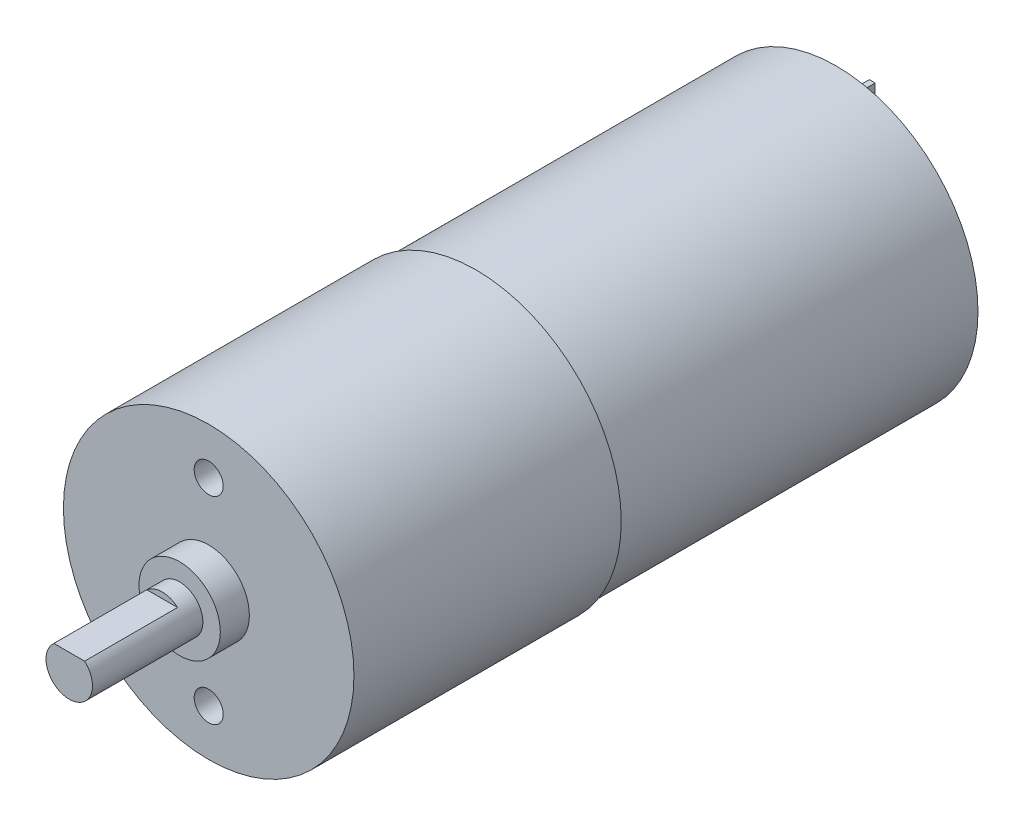
ISO-10303-21;
HEADER;
FILE_DESCRIPTION(('STEP AP214'),'2;1');
FILE_NAME('part.step','',(''),(''),'','','');
FILE_SCHEMA(('AUTOMOTIVE_DESIGN { 1 0 10303 214 1 1 1 1 }'));
ENDSEC;
DATA;
#1=APPLICATION_CONTEXT('core data for automotive mechanical design processes');
#2=APPLICATION_PROTOCOL_DEFINITION('international standard','automotive_design',2000,#1);
#3=PRODUCT_CONTEXT('',#1,'mechanical');
#4=PRODUCT('Part','Part','',(#3));
#5=PRODUCT_RELATED_PRODUCT_CATEGORY('part','',(#4));
#6=PRODUCT_DEFINITION_FORMATION('','',#4);
#7=PRODUCT_DEFINITION_CONTEXT('part definition',#1,'design');
#8=PRODUCT_DEFINITION('design','',#6,#7);
#9=PRODUCT_DEFINITION_SHAPE('','',#8);
#10=(LENGTH_UNIT() NAMED_UNIT(*) SI_UNIT(.MILLI.,.METRE.));
#11=(NAMED_UNIT(*) PLANE_ANGLE_UNIT() SI_UNIT($,.RADIAN.));
#12=(NAMED_UNIT(*) SI_UNIT($,.STERADIAN.) SOLID_ANGLE_UNIT());
#13=UNCERTAINTY_MEASURE_WITH_UNIT(LENGTH_MEASURE(1.E-05),#10,'distance_accuracy_value','');
#14=(GEOMETRIC_REPRESENTATION_CONTEXT(3) GLOBAL_UNCERTAINTY_ASSIGNED_CONTEXT((#13)) GLOBAL_UNIT_ASSIGNED_CONTEXT((#10,
#11,#12)) REPRESENTATION_CONTEXT('',''));
#15=CARTESIAN_POINT('',(0.,0.,0.));
#16=DIRECTION('',(0.,0.,1.));
#17=DIRECTION('',(1.,0.,0.));
#18=AXIS2_PLACEMENT_3D('',#15,#16,#17);
#19=CARTESIAN_POINT('',(0.,0.,-54.));
#20=DIRECTION('',(0.,0.,-1.));
#21=DIRECTION('',(-1.,0.,0.));
#22=AXIS2_PLACEMENT_3D('',#19,#20,#21);
#23=PLANE('',#22);
#24=DIRECTION('',(-1.,0.,0.));
#25=VECTOR('',#24,1.);
#26=CARTESIAN_POINT('',(0.25,7.5,-54.));
#27=LINE('',#26,#25);
#28=CARTESIAN_POINT('',(0.25,7.5,-54.));
#29=VERTEX_POINT('',#28);
#30=CARTESIAN_POINT('',(-0.25,7.5,-54.));
#31=VERTEX_POINT('',#30);
#32=EDGE_CURVE('E185',#29,#31,#27,.T.);
#33=ORIENTED_EDGE('',*,*,#32,.F.);
#34=DIRECTION('',(0.,-1.,0.));
#35=VECTOR('',#34,1.);
#36=CARTESIAN_POINT('',(0.25,9.5,-54.));
#37=LINE('',#36,#35);
#38=CARTESIAN_POINT('',(0.25,9.5,-54.));
#39=VERTEX_POINT('',#38);
#40=EDGE_CURVE('E171',#39,#29,#37,.T.);
#41=ORIENTED_EDGE('',*,*,#40,.F.);
#42=DIRECTION('',(1.,0.,0.));
#43=VECTOR('',#42,1.);
#44=CARTESIAN_POINT('',(0.25,9.5,-54.));
#45=LINE('',#44,#43);
#46=CARTESIAN_POINT('',(-0.25,9.5,-54.));
#47=VERTEX_POINT('',#46);
#48=EDGE_CURVE('E176',#47,#39,#45,.T.);
#49=ORIENTED_EDGE('',*,*,#48,.F.);
#50=DIRECTION('',(0.,1.,0.));
#51=VECTOR('',#50,1.);
#52=CARTESIAN_POINT('',(-0.25,9.5,-54.));
#53=LINE('',#52,#51);
#54=EDGE_CURVE('E187',#31,#47,#53,.T.);
#55=ORIENTED_EDGE('',*,*,#54,.F.);
#56=EDGE_LOOP('',(#33,#41,#49,#55));
#57=FACE_BOUND('',#56,.T.);
#58=CARTESIAN_POINT('',(0.,0.,-54.));
#59=DIRECTION('',(0.,0.,-1.));
#60=DIRECTION('',(-1.,0.,0.));
#61=AXIS2_PLACEMENT_3D('',#58,#59,#60);
#62=CIRCLE('',#61,12.2);
#63=CARTESIAN_POINT('',(-12.2,0.,-54.));
#64=VERTEX_POINT('',#63);
#65=EDGE_CURVE('E202',#64,#64,#62,.T.);
#66=ORIENTED_EDGE('',*,*,#65,.T.);
#67=EDGE_LOOP('',(#66));
#68=FACE_BOUND('',#67,.T.);
#69=CARTESIAN_POINT('',(0.,0.,-54.));
#70=DIRECTION('',(0.,0.,-1.));
#71=DIRECTION('',(-1.,0.,0.));
#72=AXIS2_PLACEMENT_3D('',#69,#70,#71);
#73=CIRCLE('',#72,3.2);
#74=CARTESIAN_POINT('',(-3.2,0.,-54.));
#75=VERTEX_POINT('',#74);
#76=EDGE_CURVE('E198',#75,#75,#73,.T.);
#77=ORIENTED_EDGE('',*,*,#76,.F.);
#78=EDGE_LOOP('',(#77));
#79=FACE_BOUND('',#78,.T.);
#80=DIRECTION('',(-1.,0.,0.));
#81=VECTOR('',#80,1.);
#82=CARTESIAN_POINT('',(0.25,-9.5,-54.));
#83=LINE('',#82,#81);
#84=CARTESIAN_POINT('',(0.25,-9.5,-54.));
#85=VERTEX_POINT('',#84);
#86=CARTESIAN_POINT('',(-0.25,-9.5,-54.));
#87=VERTEX_POINT('',#86);
#88=EDGE_CURVE('E158',#85,#87,#83,.T.);
#89=ORIENTED_EDGE('',*,*,#88,.F.);
#90=DIRECTION('',(0.,-1.,0.));
#91=VECTOR('',#90,1.);
#92=CARTESIAN_POINT('',(0.25,-7.5,-54.));
#93=LINE('',#92,#91);
#94=CARTESIAN_POINT('',(0.25,-7.5,-54.));
#95=VERTEX_POINT('',#94);
#96=EDGE_CURVE('E144',#95,#85,#93,.T.);
#97=ORIENTED_EDGE('',*,*,#96,.F.);
#98=DIRECTION('',(1.,0.,0.));
#99=VECTOR('',#98,1.);
#100=CARTESIAN_POINT('',(0.25,-7.5,-54.));
#101=LINE('',#100,#99);
#102=CARTESIAN_POINT('',(-0.25,-7.5,-54.));
#103=VERTEX_POINT('',#102);
#104=EDGE_CURVE('E149',#103,#95,#101,.T.);
#105=ORIENTED_EDGE('',*,*,#104,.F.);
#106=DIRECTION('',(0.,1.,0.));
#107=VECTOR('',#106,1.);
#108=CARTESIAN_POINT('',(-0.25,-7.5,-54.));
#109=LINE('',#108,#107);
#110=EDGE_CURVE('E160',#87,#103,#109,.T.);
#111=ORIENTED_EDGE('',*,*,#110,.F.);
#112=EDGE_LOOP('',(#89,#97,#105,#111));
#113=FACE_BOUND('',#112,.T.);
#114=ADVANCED_FACE('F40',(#57,#68,#79,#113),#23,.T.);
#115=CARTESIAN_POINT('',(0.,0.,-23.));
#116=DIRECTION('',(0.,0.,1.));
#117=DIRECTION('',(1.,0.,0.));
#118=AXIS2_PLACEMENT_3D('',#115,#116,#117);
#119=PLANE('',#118);
#120=CARTESIAN_POINT('',(0.,0.,-23.));
#121=DIRECTION('',(0.,0.,1.));
#122=DIRECTION('',(1.,0.,0.));
#123=AXIS2_PLACEMENT_3D('',#120,#121,#122);
#124=CIRCLE('',#123,12.5);
#125=CARTESIAN_POINT('',(12.5,0.,-23.));
#126=VERTEX_POINT('',#125);
#127=EDGE_CURVE('E230',#126,#126,#124,.T.);
#128=ORIENTED_EDGE('',*,*,#127,.F.);
#129=EDGE_LOOP('',(#128));
#130=FACE_BOUND('',#129,.T.);
#131=CARTESIAN_POINT('',(0.,0.,-23.));
#132=DIRECTION('',(0.,0.,1.));
#133=DIRECTION('',(1.,0.,0.));
#134=AXIS2_PLACEMENT_3D('',#131,#132,#133);
#135=CIRCLE('',#134,12.2);
#136=CARTESIAN_POINT('',(12.2,0.,-23.));
#137=VERTEX_POINT('',#136);
#138=EDGE_CURVE('E12',#137,#137,#135,.F.);
#139=ORIENTED_EDGE('',*,*,#138,.F.);
#140=EDGE_LOOP('',(#139));
#141=FACE_BOUND('',#140,.T.);
#142=ADVANCED_FACE('F259',(#130,#141),#119,.F.);
#143=CARTESIAN_POINT('',(0.,0.,2.5));
#144=DIRECTION('',(0.,0.,1.));
#145=DIRECTION('',(1.,0.,0.));
#146=AXIS2_PLACEMENT_3D('',#143,#144,#145);
#147=PLANE('',#146);
#148=CARTESIAN_POINT('',(0.,0.,2.5));
#149=DIRECTION('',(0.,0.,1.));
#150=DIRECTION('',(1.,0.,0.));
#151=AXIS2_PLACEMENT_3D('',#148,#149,#150);
#152=CIRCLE('',#151,3.5);
#153=CARTESIAN_POINT('',(3.5,0.,2.5));
#154=VERTEX_POINT('',#153);
#155=EDGE_CURVE('E224',#154,#154,#152,.T.);
#156=ORIENTED_EDGE('',*,*,#155,.T.);
#157=EDGE_LOOP('',(#156));
#158=FACE_BOUND('',#157,.T.);
#159=CARTESIAN_POINT('',(0.,0.,2.5));
#160=DIRECTION('',(0.,0.,1.));
#161=DIRECTION('',(1.,0.,0.));
#162=AXIS2_PLACEMENT_3D('',#159,#160,#161);
#163=CIRCLE('',#162,2.);
#164=CARTESIAN_POINT('',(2.,0.,2.5));
#165=VERTEX_POINT('',#164);
#166=EDGE_CURVE('E216',#165,#165,#163,.T.);
#167=ORIENTED_EDGE('',*,*,#166,.F.);
#168=EDGE_LOOP('',(#167));
#169=FACE_BOUND('',#168,.T.);
#170=ADVANCED_FACE('F265',(#158,#169),#147,.T.);
#171=CARTESIAN_POINT('',(0.,0.,0.));
#172=DIRECTION('',(0.,0.,1.));
#173=DIRECTION('',(1.,0.,0.));
#174=AXIS2_PLACEMENT_3D('',#171,#172,#173);
#175=PLANE('',#174);
#176=CARTESIAN_POINT('',(0.,8.5,0.));
#177=DIRECTION('',(0.,0.,1.));
#178=DIRECTION('',(1.,0.,0.));
#179=AXIS2_PLACEMENT_3D('',#176,#177,#178);
#180=CIRCLE('',#179,1.24999999999999);
#181=CARTESIAN_POINT('',(1.24999999999999,8.5,0.));
#182=VERTEX_POINT('',#181);
#183=EDGE_CURVE('E134',#182,#182,#180,.T.);
#184=ORIENTED_EDGE('',*,*,#183,.F.);
#185=EDGE_LOOP('',(#184));
#186=FACE_BOUND('',#185,.T.);
#187=CARTESIAN_POINT('',(0.,-8.5,0.));
#188=DIRECTION('',(0.,0.,1.));
#189=DIRECTION('',(1.,0.,0.));
#190=AXIS2_PLACEMENT_3D('',#187,#188,#189);
#191=CIRCLE('',#190,1.24999999999999);
#192=CARTESIAN_POINT('',(1.24999999999999,-8.5,0.));
#193=VERTEX_POINT('',#192);
#194=EDGE_CURVE('E133',#193,#193,#191,.T.);
#195=ORIENTED_EDGE('',*,*,#194,.F.);
#196=EDGE_LOOP('',(#195));
#197=FACE_BOUND('',#196,.T.);
#198=CARTESIAN_POINT('',(0.,0.,0.));
#199=DIRECTION('',(0.,0.,1.));
#200=DIRECTION('',(1.,0.,0.));
#201=AXIS2_PLACEMENT_3D('',#198,#199,#200);
#202=CIRCLE('',#201,12.5);
#203=CARTESIAN_POINT('',(12.5,0.,0.));
#204=VERTEX_POINT('',#203);
#205=EDGE_CURVE('E227',#204,#204,#202,.T.);
#206=ORIENTED_EDGE('',*,*,#205,.T.);
#207=EDGE_LOOP('',(#206));
#208=FACE_BOUND('',#207,.T.);
#209=CARTESIAN_POINT('',(0.,0.,0.));
#210=DIRECTION('',(0.,0.,1.));
#211=DIRECTION('',(1.,0.,0.));
#212=AXIS2_PLACEMENT_3D('',#209,#210,#211);
#213=CIRCLE('',#212,3.5);
#214=CARTESIAN_POINT('',(3.5,0.,0.));
#215=VERTEX_POINT('',#214);
#216=EDGE_CURVE('E223',#215,#215,#213,.T.);
#217=ORIENTED_EDGE('',*,*,#216,.F.);
#218=EDGE_LOOP('',(#217));
#219=FACE_BOUND('',#218,.T.);
#220=ADVANCED_FACE('F486',(#186,#197,#208,#219),#175,.T.);
#221=CARTESIAN_POINT('',(0.,0.,-23.));
#222=DIRECTION('',(0.,0.,1.));
#223=DIRECTION('',(1.,0.,0.));
#224=AXIS2_PLACEMENT_3D('',#221,#222,#223);
#225=CYLINDRICAL_SURFACE('',#224,12.5);
#226=ORIENTED_EDGE('',*,*,#127,.T.);
#227=EDGE_LOOP('',(#226));
#228=FACE_BOUND('',#227,.T.);
#229=ORIENTED_EDGE('',*,*,#205,.F.);
#230=EDGE_LOOP('',(#229));
#231=FACE_BOUND('',#230,.T.);
#232=ADVANCED_FACE('F42',(#228,#231),#225,.T.);
#233=CARTESIAN_POINT('',(0.,0.,2.5));
#234=DIRECTION('',(0.,0.,-1.));
#235=DIRECTION('',(-1.,0.,0.));
#236=AXIS2_PLACEMENT_3D('',#233,#234,#235);
#237=CYLINDRICAL_SURFACE('',#236,3.5);
#238=ORIENTED_EDGE('',*,*,#155,.F.);
#239=EDGE_LOOP('',(#238));
#240=FACE_BOUND('',#239,.T.);
#241=ORIENTED_EDGE('',*,*,#216,.T.);
#242=EDGE_LOOP('',(#241));
#243=FACE_BOUND('',#242,.T.);
#244=ADVANCED_FACE('F255',(#240,#243),#237,.T.);
#245=CARTESIAN_POINT('',(0.,0.,29.6568542494924));
#246=DIRECTION('',(0.,0.,-1.));
#247=DIRECTION('',(-1.,0.,0.));
#248=AXIS2_PLACEMENT_3D('',#245,#246,#247);
#249=CYLINDRICAL_SURFACE('',#248,2.);
#250=CARTESIAN_POINT('',(0.,0.,12.));
#251=DIRECTION('',(0.,0.,1.));
#252=DIRECTION('',(1.,0.,0.));
#253=AXIS2_PLACEMENT_3D('',#250,#251,#252);
#254=CIRCLE('',#253,2.);
#255=CARTESIAN_POINT('',(-1.3228756555323,1.5,12.));
#256=VERTEX_POINT('',#255);
#257=CARTESIAN_POINT('',(1.3228756555323,1.5,12.));
#258=VERTEX_POINT('',#257);
#259=EDGE_CURVE('E220',#256,#258,#254,.T.);
#260=ORIENTED_EDGE('',*,*,#259,.F.);
#261=DIRECTION('',(0.,0.,1.));
#262=VECTOR('',#261,1.);
#263=CARTESIAN_POINT('',(-1.3228756555323,1.5,4.));
#264=LINE('',#263,#262);
#265=CARTESIAN_POINT('',(-1.3228756555323,1.5,4.));
#266=VERTEX_POINT('',#265);
#267=EDGE_CURVE('E211',#266,#256,#264,.T.);
#268=ORIENTED_EDGE('',*,*,#267,.F.);
#269=CARTESIAN_POINT('',(0.,0.,4.));
#270=DIRECTION('',(0.,0.,-1.));
#271=DIRECTION('',(-1.,0.,0.));
#272=AXIS2_PLACEMENT_3D('',#269,#270,#271);
#273=CIRCLE('',#272,2.);
#274=CARTESIAN_POINT('',(1.3228756555323,1.5,4.));
#275=VERTEX_POINT('',#274);
#276=EDGE_CURVE('E48',#266,#275,#273,.T.);
#277=ORIENTED_EDGE('',*,*,#276,.T.);
#278=DIRECTION('',(0.,0.,1.));
#279=VECTOR('',#278,1.);
#280=CARTESIAN_POINT('',(1.3228756555323,1.5,4.));
#281=LINE('',#280,#279);
#282=EDGE_CURVE('E213',#275,#258,#281,.T.);
#283=ORIENTED_EDGE('',*,*,#282,.T.);
#284=EDGE_LOOP('',(#260,#268,#277,#283));
#285=FACE_BOUND('',#284,.T.);
#286=ORIENTED_EDGE('',*,*,#166,.T.);
#287=EDGE_LOOP('',(#286));
#288=FACE_BOUND('',#287,.T.);
#289=ADVANCED_FACE('F238',(#285,#288),#249,.T.);
#290=CARTESIAN_POINT('',(0.,0.,12.));
#291=DIRECTION('',(0.,0.,1.));
#292=DIRECTION('',(1.,0.,0.));
#293=AXIS2_PLACEMENT_3D('',#290,#291,#292);
#294=PLANE('',#293);
#295=DIRECTION('',(1.,0.,0.));
#296=VECTOR('',#295,1.);
#297=CARTESIAN_POINT('',(-1.3228756555323,1.5,12.));
#298=LINE('',#297,#296);
#299=EDGE_CURVE('E207',#256,#258,#298,.T.);
#300=ORIENTED_EDGE('',*,*,#299,.F.);
#301=ORIENTED_EDGE('',*,*,#259,.T.);
#302=EDGE_LOOP('',(#300,#301));
#303=FACE_BOUND('',#302,.T.);
#304=ADVANCED_FACE('F247',(#303),#294,.T.);
#305=CARTESIAN_POINT('',(0.,0.,4.));
#306=DIRECTION('',(0.,0.,-1.));
#307=DIRECTION('',(-1.,0.,0.));
#308=AXIS2_PLACEMENT_3D('',#305,#306,#307);
#309=PLANE('',#308);
#310=DIRECTION('',(1.,0.,0.));
#311=VECTOR('',#310,1.);
#312=CARTESIAN_POINT('',(-1.3228756555323,1.5,4.));
#313=LINE('',#312,#311);
#314=EDGE_CURVE('E208',#266,#275,#313,.T.);
#315=ORIENTED_EDGE('',*,*,#314,.T.);
#316=ORIENTED_EDGE('',*,*,#276,.F.);
#317=EDGE_LOOP('',(#315,#316));
#318=FACE_BOUND('',#317,.T.);
#319=ADVANCED_FACE('F242',(#318),#309,.F.);
#320=CARTESIAN_POINT('',(-1.3228756555323,1.5,4.));
#321=DIRECTION('',(0.,-1.,0.));
#322=DIRECTION('',(0.,0.,-1.));
#323=AXIS2_PLACEMENT_3D('',#320,#321,#322);
#324=PLANE('',#323);
#325=ORIENTED_EDGE('',*,*,#299,.T.);
#326=ORIENTED_EDGE('',*,*,#282,.F.);
#327=ORIENTED_EDGE('',*,*,#314,.F.);
#328=ORIENTED_EDGE('',*,*,#267,.T.);
#329=EDGE_LOOP('',(#325,#326,#327,#328));
#330=FACE_BOUND('',#329,.T.);
#331=ADVANCED_FACE('F244',(#330),#324,.F.);
#332=CARTESIAN_POINT('',(0.,0.,-54.));
#333=DIRECTION('',(0.,0.,1.));
#334=DIRECTION('',(1.,0.,0.));
#335=AXIS2_PLACEMENT_3D('',#332,#333,#334);
#336=CYLINDRICAL_SURFACE('',#335,12.2);
#337=ORIENTED_EDGE('',*,*,#65,.F.);
#338=EDGE_LOOP('',(#337));
#339=FACE_BOUND('',#338,.T.);
#340=ORIENTED_EDGE('',*,*,#138,.T.);
#341=EDGE_LOOP('',(#340));
#342=FACE_BOUND('',#341,.T.);
#343=ADVANCED_FACE('F274',(#339,#342),#336,.T.);
#344=CARTESIAN_POINT('',(0.,0.,-55.4));
#345=DIRECTION('',(0.,0.,1.));
#346=DIRECTION('',(1.,0.,0.));
#347=AXIS2_PLACEMENT_3D('',#344,#345,#346);
#348=CYLINDRICAL_SURFACE('',#347,3.2);
#349=CARTESIAN_POINT('',(0.,0.,-55.4));
#350=DIRECTION('',(0.,0.,-1.));
#351=DIRECTION('',(-1.,0.,0.));
#352=AXIS2_PLACEMENT_3D('',#349,#350,#351);
#353=CIRCLE('',#352,3.2);
#354=CARTESIAN_POINT('',(-3.2,0.,-55.4));
#355=VERTEX_POINT('',#354);
#356=EDGE_CURVE('E199',#355,#355,#353,.T.);
#357=ORIENTED_EDGE('',*,*,#356,.F.);
#358=EDGE_LOOP('',(#357));
#359=FACE_BOUND('',#358,.T.);
#360=ORIENTED_EDGE('',*,*,#76,.T.);
#361=EDGE_LOOP('',(#360));
#362=FACE_BOUND('',#361,.T.);
#363=ADVANCED_FACE('F272',(#359,#362),#348,.T.);
#364=CARTESIAN_POINT('',(0.,0.,-55.4));
#365=DIRECTION('',(0.,0.,-1.));
#366=DIRECTION('',(-1.,0.,0.));
#367=AXIS2_PLACEMENT_3D('',#364,#365,#366);
#368=PLANE('',#367);
#369=ORIENTED_EDGE('',*,*,#356,.T.);
#370=EDGE_LOOP('',(#369));
#371=FACE_BOUND('',#370,.T.);
#372=ADVANCED_FACE('F295',(#371),#368,.T.);
#373=CARTESIAN_POINT('',(0.25,9.5,-57.1));
#374=DIRECTION('',(-1.,0.,0.));
#375=DIRECTION('',(0.,-1.,0.));
#376=AXIS2_PLACEMENT_3D('',#373,#374,#375);
#377=PLANE('',#376);
#378=ORIENTED_EDGE('',*,*,#40,.T.);
#379=DIRECTION('',(0.,0.,1.));
#380=VECTOR('',#379,1.);
#381=CARTESIAN_POINT('',(0.25,7.5,-57.1));
#382=LINE('',#381,#380);
#383=CARTESIAN_POINT('',(0.25,7.5,-57.1));
#384=VERTEX_POINT('',#383);
#385=EDGE_CURVE('E196',#384,#29,#382,.T.);
#386=ORIENTED_EDGE('',*,*,#385,.F.);
#387=DIRECTION('',(0.,-1.,0.));
#388=VECTOR('',#387,1.);
#389=CARTESIAN_POINT('',(0.25,9.5,-57.1));
#390=LINE('',#389,#388);
#391=CARTESIAN_POINT('',(0.25,9.5,-57.1));
#392=VERTEX_POINT('',#391);
#393=EDGE_CURVE('E172',#392,#384,#390,.T.);
#394=ORIENTED_EDGE('',*,*,#393,.F.);
#395=DIRECTION('',(0.,0.,1.));
#396=VECTOR('',#395,1.);
#397=CARTESIAN_POINT('',(0.25,9.5,-57.1));
#398=LINE('',#397,#396);
#399=EDGE_CURVE('E182',#392,#39,#398,.T.);
#400=ORIENTED_EDGE('',*,*,#399,.T.);
#401=EDGE_LOOP('',(#378,#386,#394,#400));
#402=FACE_BOUND('',#401,.T.);
#403=ADVANCED_FACE('F302',(#402),#377,.F.);
#404=CARTESIAN_POINT('',(0.25,7.5,-57.1));
#405=DIRECTION('',(0.,1.,0.));
#406=DIRECTION('',(-1.,0.,0.));
#407=AXIS2_PLACEMENT_3D('',#404,#405,#406);
#408=PLANE('',#407);
#409=ORIENTED_EDGE('',*,*,#32,.T.);
#410=DIRECTION('',(0.,0.,1.));
#411=VECTOR('',#410,1.);
#412=CARTESIAN_POINT('',(-0.25,7.5,-57.1));
#413=LINE('',#412,#411);
#414=CARTESIAN_POINT('',(-0.25,7.5,-57.1));
#415=VERTEX_POINT('',#414);
#416=EDGE_CURVE('E193',#415,#31,#413,.T.);
#417=ORIENTED_EDGE('',*,*,#416,.F.);
#418=DIRECTION('',(-1.,0.,0.));
#419=VECTOR('',#418,1.);
#420=CARTESIAN_POINT('',(0.25,7.5,-57.1));
#421=LINE('',#420,#419);
#422=EDGE_CURVE('E175',#384,#415,#421,.T.);
#423=ORIENTED_EDGE('',*,*,#422,.F.);
#424=ORIENTED_EDGE('',*,*,#385,.T.);
#425=EDGE_LOOP('',(#409,#417,#423,#424));
#426=FACE_BOUND('',#425,.T.);
#427=ADVANCED_FACE('F310',(#426),#408,.F.);
#428=CARTESIAN_POINT('',(-0.25,9.5,-57.1));
#429=DIRECTION('',(1.,0.,0.));
#430=DIRECTION('',(0.,1.,0.));
#431=AXIS2_PLACEMENT_3D('',#428,#429,#430);
#432=PLANE('',#431);
#433=ORIENTED_EDGE('',*,*,#54,.T.);
#434=DIRECTION('',(0.,0.,1.));
#435=VECTOR('',#434,1.);
#436=CARTESIAN_POINT('',(-0.25,9.5,-57.1));
#437=LINE('',#436,#435);
#438=CARTESIAN_POINT('',(-0.25,9.5,-57.1));
#439=VERTEX_POINT('',#438);
#440=EDGE_CURVE('E63',#439,#47,#437,.T.);
#441=ORIENTED_EDGE('',*,*,#440,.F.);
#442=DIRECTION('',(0.,1.,0.));
#443=VECTOR('',#442,1.);
#444=CARTESIAN_POINT('',(-0.25,9.5,-57.1));
#445=LINE('',#444,#443);
#446=EDGE_CURVE('E178',#415,#439,#445,.T.);
#447=ORIENTED_EDGE('',*,*,#446,.F.);
#448=ORIENTED_EDGE('',*,*,#416,.T.);
#449=EDGE_LOOP('',(#433,#441,#447,#448));
#450=FACE_BOUND('',#449,.T.);
#451=ADVANCED_FACE('F319',(#450),#432,.F.);
#452=CARTESIAN_POINT('',(0.25,9.5,-57.1));
#453=DIRECTION('',(0.,-1.,0.));
#454=DIRECTION('',(0.,0.,-1.));
#455=AXIS2_PLACEMENT_3D('',#452,#453,#454);
#456=PLANE('',#455);
#457=ORIENTED_EDGE('',*,*,#48,.T.);
#458=ORIENTED_EDGE('',*,*,#399,.F.);
#459=DIRECTION('',(1.,0.,0.));
#460=VECTOR('',#459,1.);
#461=CARTESIAN_POINT('',(0.25,9.5,-57.1));
#462=LINE('',#461,#460);
#463=EDGE_CURVE('E180',#439,#392,#462,.T.);
#464=ORIENTED_EDGE('',*,*,#463,.F.);
#465=ORIENTED_EDGE('',*,*,#440,.T.);
#466=EDGE_LOOP('',(#457,#458,#464,#465));
#467=FACE_BOUND('',#466,.T.);
#468=ADVANCED_FACE('F327',(#467),#456,.F.);
#469=CARTESIAN_POINT('',(0.,0.,-57.1));
#470=DIRECTION('',(0.,0.,-1.));
#471=DIRECTION('',(-1.,0.,0.));
#472=AXIS2_PLACEMENT_3D('',#469,#470,#471);
#473=PLANE('',#472);
#474=ORIENTED_EDGE('',*,*,#393,.T.);
#475=ORIENTED_EDGE('',*,*,#422,.T.);
#476=ORIENTED_EDGE('',*,*,#446,.T.);
#477=ORIENTED_EDGE('',*,*,#463,.T.);
#478=EDGE_LOOP('',(#474,#475,#476,#477));
#479=FACE_BOUND('',#478,.T.);
#480=ADVANCED_FACE('F335',(#479),#473,.T.);
#481=CARTESIAN_POINT('',(0.25,-7.5,-57.1));
#482=DIRECTION('',(-1.,0.,0.));
#483=DIRECTION('',(0.,-1.,0.));
#484=AXIS2_PLACEMENT_3D('',#481,#482,#483);
#485=PLANE('',#484);
#486=ORIENTED_EDGE('',*,*,#96,.T.);
#487=DIRECTION('',(0.,0.,1.));
#488=VECTOR('',#487,1.);
#489=CARTESIAN_POINT('',(0.25,-9.5,-57.1));
#490=LINE('',#489,#488);
#491=CARTESIAN_POINT('',(0.25,-9.5,-57.1));
#492=VERTEX_POINT('',#491);
#493=EDGE_CURVE('E169',#492,#85,#490,.T.);
#494=ORIENTED_EDGE('',*,*,#493,.F.);
#495=DIRECTION('',(0.,-1.,0.));
#496=VECTOR('',#495,1.);
#497=CARTESIAN_POINT('',(0.25,-7.5,-57.1));
#498=LINE('',#497,#496);
#499=CARTESIAN_POINT('',(0.25,-7.5,-57.1));
#500=VERTEX_POINT('',#499);
#501=EDGE_CURVE('E145',#500,#492,#498,.T.);
#502=ORIENTED_EDGE('',*,*,#501,.F.);
#503=DIRECTION('',(0.,0.,1.));
#504=VECTOR('',#503,1.);
#505=CARTESIAN_POINT('',(0.25,-7.5,-57.1));
#506=LINE('',#505,#504);
#507=EDGE_CURVE('E155',#500,#95,#506,.T.);
#508=ORIENTED_EDGE('',*,*,#507,.T.);
#509=EDGE_LOOP('',(#486,#494,#502,#508));
#510=FACE_BOUND('',#509,.T.);
#511=ADVANCED_FACE('F342',(#510),#485,.F.);
#512=CARTESIAN_POINT('',(0.25,-9.5,-57.1));
#513=DIRECTION('',(0.,1.,0.));
#514=DIRECTION('',(0.,0.,1.));
#515=AXIS2_PLACEMENT_3D('',#512,#513,#514);
#516=PLANE('',#515);
#517=ORIENTED_EDGE('',*,*,#88,.T.);
#518=DIRECTION('',(0.,0.,1.));
#519=VECTOR('',#518,1.);
#520=CARTESIAN_POINT('',(-0.25,-9.5,-57.1));
#521=LINE('',#520,#519);
#522=CARTESIAN_POINT('',(-0.25,-9.5,-57.1));
#523=VERTEX_POINT('',#522);
#524=EDGE_CURVE('E166',#523,#87,#521,.T.);
#525=ORIENTED_EDGE('',*,*,#524,.F.);
#526=DIRECTION('',(-1.,0.,0.));
#527=VECTOR('',#526,1.);
#528=CARTESIAN_POINT('',(0.25,-9.5,-57.1));
#529=LINE('',#528,#527);
#530=EDGE_CURVE('E148',#492,#523,#529,.T.);
#531=ORIENTED_EDGE('',*,*,#530,.F.);
#532=ORIENTED_EDGE('',*,*,#493,.T.);
#533=EDGE_LOOP('',(#517,#525,#531,#532));
#534=FACE_BOUND('',#533,.T.);
#535=ADVANCED_FACE('F350',(#534),#516,.F.);
#536=CARTESIAN_POINT('',(-0.25,-7.5,-57.1));
#537=DIRECTION('',(1.,0.,0.));
#538=DIRECTION('',(0.,1.,0.));
#539=AXIS2_PLACEMENT_3D('',#536,#537,#538);
#540=PLANE('',#539);
#541=ORIENTED_EDGE('',*,*,#110,.T.);
#542=DIRECTION('',(0.,0.,1.));
#543=VECTOR('',#542,1.);
#544=CARTESIAN_POINT('',(-0.25,-7.5,-57.1));
#545=LINE('',#544,#543);
#546=CARTESIAN_POINT('',(-0.25,-7.5,-57.1));
#547=VERTEX_POINT('',#546);
#548=EDGE_CURVE('E55',#547,#103,#545,.T.);
#549=ORIENTED_EDGE('',*,*,#548,.F.);
#550=DIRECTION('',(0.,1.,0.));
#551=VECTOR('',#550,1.);
#552=CARTESIAN_POINT('',(-0.25,-7.5,-57.1));
#553=LINE('',#552,#551);
#554=EDGE_CURVE('E151',#523,#547,#553,.T.);
#555=ORIENTED_EDGE('',*,*,#554,.F.);
#556=ORIENTED_EDGE('',*,*,#524,.T.);
#557=EDGE_LOOP('',(#541,#549,#555,#556));
#558=FACE_BOUND('',#557,.T.);
#559=ADVANCED_FACE('F358',(#558),#540,.F.);
#560=CARTESIAN_POINT('',(0.25,-7.5,-57.1));
#561=DIRECTION('',(0.,-1.,0.));
#562=DIRECTION('',(0.,0.,-1.));
#563=AXIS2_PLACEMENT_3D('',#560,#561,#562);
#564=PLANE('',#563);
#565=ORIENTED_EDGE('',*,*,#104,.T.);
#566=ORIENTED_EDGE('',*,*,#507,.F.);
#567=DIRECTION('',(1.,0.,0.));
#568=VECTOR('',#567,1.);
#569=CARTESIAN_POINT('',(0.25,-7.5,-57.1));
#570=LINE('',#569,#568);
#571=EDGE_CURVE('E153',#547,#500,#570,.T.);
#572=ORIENTED_EDGE('',*,*,#571,.F.);
#573=ORIENTED_EDGE('',*,*,#548,.T.);
#574=EDGE_LOOP('',(#565,#566,#572,#573));
#575=FACE_BOUND('',#574,.T.);
#576=ADVANCED_FACE('F366',(#575),#564,.F.);
#577=CARTESIAN_POINT('',(0.,0.,-57.1));
#578=DIRECTION('',(0.,0.,-1.));
#579=DIRECTION('',(-1.,0.,0.));
#580=AXIS2_PLACEMENT_3D('',#577,#578,#579);
#581=PLANE('',#580);
#582=ORIENTED_EDGE('',*,*,#501,.T.);
#583=ORIENTED_EDGE('',*,*,#530,.T.);
#584=ORIENTED_EDGE('',*,*,#554,.T.);
#585=ORIENTED_EDGE('',*,*,#571,.T.);
#586=EDGE_LOOP('',(#582,#583,#584,#585));
#587=FACE_BOUND('',#586,.T.);
#588=ADVANCED_FACE('F374',(#587),#581,.T.);
#589=CARTESIAN_POINT('',(0.,-8.5,-8.50000000000001));
#590=DIRECTION('',(0.,0.,1.));
#591=DIRECTION('',(1.,0.,0.));
#592=AXIS2_PLACEMENT_3D('',#589,#590,#591);
#593=CONICAL_SURFACE('',#592,1.24999999999999,1.02974425867665);
#594=CARTESIAN_POINT('',(0.,-8.5,-9.25107577378445));
#595=VERTEX_POINT('',#594);
#596=VERTEX_LOOP('',#595);
#597=FACE_BOUND('',#596,.T.);
#598=CARTESIAN_POINT('',(0.,-8.5,-8.50000000000001));
#599=DIRECTION('',(0.,0.,1.));
#600=DIRECTION('',(1.,0.,0.));
#601=AXIS2_PLACEMENT_3D('',#598,#599,#600);
#602=CIRCLE('',#601,1.24999999999999);
#603=CARTESIAN_POINT('',(1.24999999999999,-8.5,-8.50000000000001));
#604=VERTEX_POINT('',#603);
#605=EDGE_CURVE('E137',#604,#604,#602,.T.);
#606=ORIENTED_EDGE('',*,*,#605,.T.);
#607=EDGE_LOOP('',(#606));
#608=FACE_BOUND('',#607,.T.);
#609=ADVANCED_FACE('F381',(#597,#608),#593,.F.);
#610=CARTESIAN_POINT('',(0.,-8.5,0.));
#611=DIRECTION('',(0.,0.,1.));
#612=DIRECTION('',(1.,0.,0.));
#613=AXIS2_PLACEMENT_3D('',#610,#611,#612);
#614=CYLINDRICAL_SURFACE('',#613,1.24999999999999);
#615=ORIENTED_EDGE('',*,*,#605,.F.);
#616=EDGE_LOOP('',(#615));
#617=FACE_BOUND('',#616,.T.);
#618=ORIENTED_EDGE('',*,*,#194,.T.);
#619=EDGE_LOOP('',(#618));
#620=FACE_BOUND('',#619,.T.);
#621=ADVANCED_FACE('F127',(#617,#620),#614,.F.);
#622=CARTESIAN_POINT('',(0.,8.5,-8.50000000000001));
#623=DIRECTION('',(0.,0.,1.));
#624=DIRECTION('',(1.,0.,0.));
#625=AXIS2_PLACEMENT_3D('',#622,#623,#624);
#626=CONICAL_SURFACE('',#625,1.24999999999999,1.02974425867665);
#627=CARTESIAN_POINT('',(0.,8.5,-9.25107577378445));
#628=VERTEX_POINT('',#627);
#629=VERTEX_LOOP('',#628);
#630=FACE_BOUND('',#629,.T.);
#631=CARTESIAN_POINT('',(0.,8.5,-8.50000000000001));
#632=DIRECTION('',(0.,0.,1.));
#633=DIRECTION('',(1.,0.,0.));
#634=AXIS2_PLACEMENT_3D('',#631,#632,#633);
#635=CIRCLE('',#634,1.24999999999999);
#636=CARTESIAN_POINT('',(1.24999999999999,8.5,-8.50000000000001));
#637=VERTEX_POINT('',#636);
#638=EDGE_CURVE('E131',#637,#637,#635,.T.);
#639=ORIENTED_EDGE('',*,*,#638,.T.);
#640=EDGE_LOOP('',(#639));
#641=FACE_BOUND('',#640,.T.);
#642=ADVANCED_FACE('F123',(#630,#641),#626,.F.);
#643=CARTESIAN_POINT('',(0.,8.5,0.));
#644=DIRECTION('',(0.,0.,1.));
#645=DIRECTION('',(1.,0.,0.));
#646=AXIS2_PLACEMENT_3D('',#643,#644,#645);
#647=CYLINDRICAL_SURFACE('',#646,1.24999999999999);
#648=ORIENTED_EDGE('',*,*,#638,.F.);
#649=EDGE_LOOP('',(#648));
#650=FACE_BOUND('',#649,.T.);
#651=ORIENTED_EDGE('',*,*,#183,.T.);
#652=EDGE_LOOP('',(#651));
#653=FACE_BOUND('',#652,.T.);
#654=ADVANCED_FACE('F126',(#650,#653),#647,.F.);
#655=CLOSED_SHELL('',(#114,#142,#170,#220,#232,#244,#289,#304,#319,#331,#343,#363,#372,#403,
#427,#451,#468,#480,#511,#535,#559,#576,#588,#609,#621,#642,#654));
#656=MANIFOLD_SOLID_BREP('B2',#655);
#657=ADVANCED_BREP_SHAPE_REPRESENTATION('',(#18,#656),#14);
#658=SHAPE_DEFINITION_REPRESENTATION(#9,#657);
ENDSEC;
END-ISO-10303-21;
